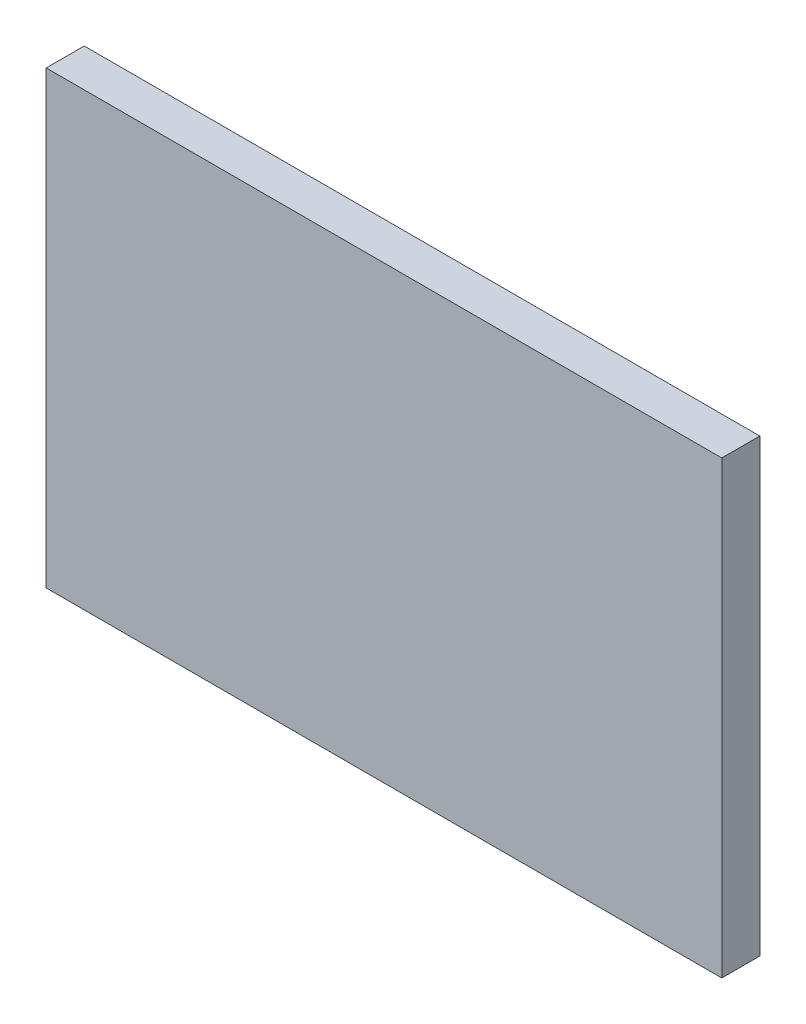
ISO-10303-21;
HEADER;
FILE_DESCRIPTION(('STEP AP214'),'2;1');
FILE_NAME('part.step','',(''),(''),'','','');
FILE_SCHEMA(('AUTOMOTIVE_DESIGN { 1 0 10303 214 1 1 1 1 }'));
ENDSEC;
DATA;
#1=APPLICATION_CONTEXT('core data for automotive mechanical design processes');
#2=APPLICATION_PROTOCOL_DEFINITION('international standard','automotive_design',2000,#1);
#3=PRODUCT_CONTEXT('',#1,'mechanical');
#4=PRODUCT('Part','Part','',(#3));
#5=PRODUCT_RELATED_PRODUCT_CATEGORY('part','',(#4));
#6=PRODUCT_DEFINITION_FORMATION('','',#4);
#7=PRODUCT_DEFINITION_CONTEXT('part definition',#1,'design');
#8=PRODUCT_DEFINITION('design','',#6,#7);
#9=PRODUCT_DEFINITION_SHAPE('','',#8);
#10=(LENGTH_UNIT() NAMED_UNIT(*) SI_UNIT(.MILLI.,.METRE.));
#11=(NAMED_UNIT(*) PLANE_ANGLE_UNIT() SI_UNIT($,.RADIAN.));
#12=(NAMED_UNIT(*) SI_UNIT($,.STERADIAN.) SOLID_ANGLE_UNIT());
#13=UNCERTAINTY_MEASURE_WITH_UNIT(LENGTH_MEASURE(1.E-05),#10,'distance_accuracy_value','');
#14=(GEOMETRIC_REPRESENTATION_CONTEXT(3) GLOBAL_UNCERTAINTY_ASSIGNED_CONTEXT((#13)) GLOBAL_UNIT_ASSIGNED_CONTEXT((#10,
#11,#12)) REPRESENTATION_CONTEXT('',''));
#15=CARTESIAN_POINT('',(0.,0.,0.));
#16=DIRECTION('',(0.,0.,1.));
#17=DIRECTION('',(1.,0.,0.));
#18=AXIS2_PLACEMENT_3D('',#15,#16,#17);
#19=CARTESIAN_POINT('',(-54.9933962264151,-131.373113207547,5.8928));
#20=DIRECTION('',(-1.,0.,0.));
#21=DIRECTION('',(0.,0.,1.));
#22=AXIS2_PLACEMENT_3D('',#19,#20,#21);
#23=PLANE('',#22);
#24=DIRECTION('',(0.,1.,0.));
#25=VECTOR('',#24,1.);
#26=CARTESIAN_POINT('',(-54.9933962264151,-131.373113207547,0.));
#27=LINE('',#26,#25);
#28=CARTESIAN_POINT('',(-54.9933962264151,-131.373113207547,0.));
#29=VERTEX_POINT('',#28);
#30=CARTESIAN_POINT('',(-54.9933962264151,-61.5231132075472,0.));
#31=VERTEX_POINT('',#30);
#32=EDGE_CURVE('E96',#29,#31,#27,.T.);
#33=ORIENTED_EDGE('',*,*,#32,.T.);
#34=DIRECTION('',(0.,0.,-1.));
#35=VECTOR('',#34,1.);
#36=CARTESIAN_POINT('',(-54.9933962264151,-61.5231132075472,5.8928));
#37=LINE('',#36,#35);
#38=CARTESIAN_POINT('',(-54.9933962264151,-61.5231132075472,5.8928));
#39=VERTEX_POINT('',#38);
#40=EDGE_CURVE('E11',#39,#31,#37,.T.);
#41=ORIENTED_EDGE('',*,*,#40,.F.);
#42=DIRECTION('',(0.,1.,0.));
#43=VECTOR('',#42,1.);
#44=CARTESIAN_POINT('',(-54.9933962264151,-131.373113207547,5.8928));
#45=LINE('',#44,#43);
#46=CARTESIAN_POINT('',(-54.9933962264151,-131.373113207547,5.8928));
#47=VERTEX_POINT('',#46);
#48=EDGE_CURVE('E84',#47,#39,#45,.T.);
#49=ORIENTED_EDGE('',*,*,#48,.F.);
#50=DIRECTION('',(0.,0.,-1.));
#51=VECTOR('',#50,1.);
#52=CARTESIAN_POINT('',(-54.9933962264151,-131.373113207547,5.8928));
#53=LINE('',#52,#51);
#54=EDGE_CURVE('E92',#47,#29,#53,.T.);
#55=ORIENTED_EDGE('',*,*,#54,.T.);
#56=EDGE_LOOP('',(#33,#41,#49,#55));
#57=FACE_BOUND('',#56,.T.);
#58=ADVANCED_FACE('F33',(#57),#23,.F.);
#59=CARTESIAN_POINT('',(-159.768396226415,-61.5231132075472,5.8928));
#60=DIRECTION('',(0.,-1.,0.));
#61=DIRECTION('',(0.,0.,-1.));
#62=AXIS2_PLACEMENT_3D('',#59,#60,#61);
#63=PLANE('',#62);
#64=DIRECTION('',(-1.,0.,0.));
#65=VECTOR('',#64,1.);
#66=CARTESIAN_POINT('',(-159.768396226415,-61.5231132075472,0.));
#67=LINE('',#66,#65);
#68=CARTESIAN_POINT('',(-159.768396226415,-61.5231132075472,0.));
#69=VERTEX_POINT('',#68);
#70=EDGE_CURVE('E88',#31,#69,#67,.T.);
#71=ORIENTED_EDGE('',*,*,#70,.T.);
#72=DIRECTION('',(0.,0.,-1.));
#73=VECTOR('',#72,1.);
#74=CARTESIAN_POINT('',(-159.768396226415,-61.5231132075472,5.8928));
#75=LINE('',#74,#73);
#76=CARTESIAN_POINT('',(-159.768396226415,-61.5231132075472,5.8928));
#77=VERTEX_POINT('',#76);
#78=EDGE_CURVE('E41',#77,#69,#75,.T.);
#79=ORIENTED_EDGE('',*,*,#78,.F.);
#80=DIRECTION('',(-1.,0.,0.));
#81=VECTOR('',#80,1.);
#82=CARTESIAN_POINT('',(-159.768396226415,-61.5231132075472,5.8928));
#83=LINE('',#82,#81);
#84=EDGE_CURVE('E79',#39,#77,#83,.T.);
#85=ORIENTED_EDGE('',*,*,#84,.F.);
#86=ORIENTED_EDGE('',*,*,#40,.T.);
#87=EDGE_LOOP('',(#71,#79,#85,#86));
#88=FACE_BOUND('',#87,.T.);
#89=ADVANCED_FACE('F87',(#88),#63,.F.);
#90=CARTESIAN_POINT('',(-159.768396226415,-131.373113207547,5.8928));
#91=DIRECTION('',(1.,0.,0.));
#92=DIRECTION('',(0.,0.,-1.));
#93=AXIS2_PLACEMENT_3D('',#90,#91,#92);
#94=PLANE('',#93);
#95=DIRECTION('',(0.,-1.,0.));
#96=VECTOR('',#95,1.);
#97=CARTESIAN_POINT('',(-159.768396226415,-131.373113207547,0.));
#98=LINE('',#97,#96);
#99=CARTESIAN_POINT('',(-159.768396226415,-131.373113207547,0.));
#100=VERTEX_POINT('',#99);
#101=EDGE_CURVE('E66',#69,#100,#98,.T.);
#102=ORIENTED_EDGE('',*,*,#101,.T.);
#103=DIRECTION('',(0.,0.,-1.));
#104=VECTOR('',#103,1.);
#105=CARTESIAN_POINT('',(-159.768396226415,-131.373113207547,5.8928));
#106=LINE('',#105,#104);
#107=CARTESIAN_POINT('',(-159.768396226415,-131.373113207547,5.8928));
#108=VERTEX_POINT('',#107);
#109=EDGE_CURVE('E89',#108,#100,#106,.T.);
#110=ORIENTED_EDGE('',*,*,#109,.F.);
#111=DIRECTION('',(0.,-1.,0.));
#112=VECTOR('',#111,1.);
#113=CARTESIAN_POINT('',(-159.768396226415,-131.373113207547,5.8928));
#114=LINE('',#113,#112);
#115=EDGE_CURVE('E82',#77,#108,#114,.T.);
#116=ORIENTED_EDGE('',*,*,#115,.F.);
#117=ORIENTED_EDGE('',*,*,#78,.T.);
#118=EDGE_LOOP('',(#102,#110,#116,#117));
#119=FACE_BOUND('',#118,.T.);
#120=ADVANCED_FACE('F90',(#119),#94,.F.);
#121=CARTESIAN_POINT('',(-159.768396226415,-131.373113207547,5.8928));
#122=DIRECTION('',(0.,1.,0.));
#123=DIRECTION('',(0.,0.,1.));
#124=AXIS2_PLACEMENT_3D('',#121,#122,#123);
#125=PLANE('',#124);
#126=DIRECTION('',(1.,0.,0.));
#127=VECTOR('',#126,1.);
#128=CARTESIAN_POINT('',(-159.768396226415,-131.373113207547,0.));
#129=LINE('',#128,#127);
#130=EDGE_CURVE('E72',#100,#29,#129,.T.);
#131=ORIENTED_EDGE('',*,*,#130,.T.);
#132=ORIENTED_EDGE('',*,*,#54,.F.);
#133=DIRECTION('',(1.,0.,0.));
#134=VECTOR('',#133,1.);
#135=CARTESIAN_POINT('',(-159.768396226415,-131.373113207547,5.8928));
#136=LINE('',#135,#134);
#137=EDGE_CURVE('E49',#108,#47,#136,.T.);
#138=ORIENTED_EDGE('',*,*,#137,.F.);
#139=ORIENTED_EDGE('',*,*,#109,.T.);
#140=EDGE_LOOP('',(#131,#132,#138,#139));
#141=FACE_BOUND('',#140,.T.);
#142=ADVANCED_FACE('F103',(#141),#125,.F.);
#143=CARTESIAN_POINT('',(0.,0.,5.8928));
#144=DIRECTION('',(0.,0.,-1.));
#145=DIRECTION('',(-1.,0.,0.));
#146=AXIS2_PLACEMENT_3D('',#143,#144,#145);
#147=PLANE('',#146);
#148=ORIENTED_EDGE('',*,*,#48,.T.);
#149=ORIENTED_EDGE('',*,*,#84,.T.);
#150=ORIENTED_EDGE('',*,*,#115,.T.);
#151=ORIENTED_EDGE('',*,*,#137,.T.);
#152=EDGE_LOOP('',(#148,#149,#150,#151));
#153=FACE_BOUND('',#152,.T.);
#154=ADVANCED_FACE('F80',(#153),#147,.F.);
#155=CARTESIAN_POINT('',(0.,0.,0.));
#156=DIRECTION('',(0.,0.,-1.));
#157=DIRECTION('',(-1.,0.,0.));
#158=AXIS2_PLACEMENT_3D('',#155,#156,#157);
#159=PLANE('',#158);
#160=ORIENTED_EDGE('',*,*,#32,.F.);
#161=ORIENTED_EDGE('',*,*,#130,.F.);
#162=ORIENTED_EDGE('',*,*,#101,.F.);
#163=ORIENTED_EDGE('',*,*,#70,.F.);
#164=EDGE_LOOP('',(#160,#161,#162,#163));
#165=FACE_BOUND('',#164,.T.);
#166=ADVANCED_FACE('F106',(#165),#159,.T.);
#167=CLOSED_SHELL('',(#58,#89,#120,#142,#154,#166));
#168=MANIFOLD_SOLID_BREP('B2',#167);
#169=ADVANCED_BREP_SHAPE_REPRESENTATION('',(#18,#168),#14);
#170=SHAPE_DEFINITION_REPRESENTATION(#9,#169);
ENDSEC;
END-ISO-10303-21;
